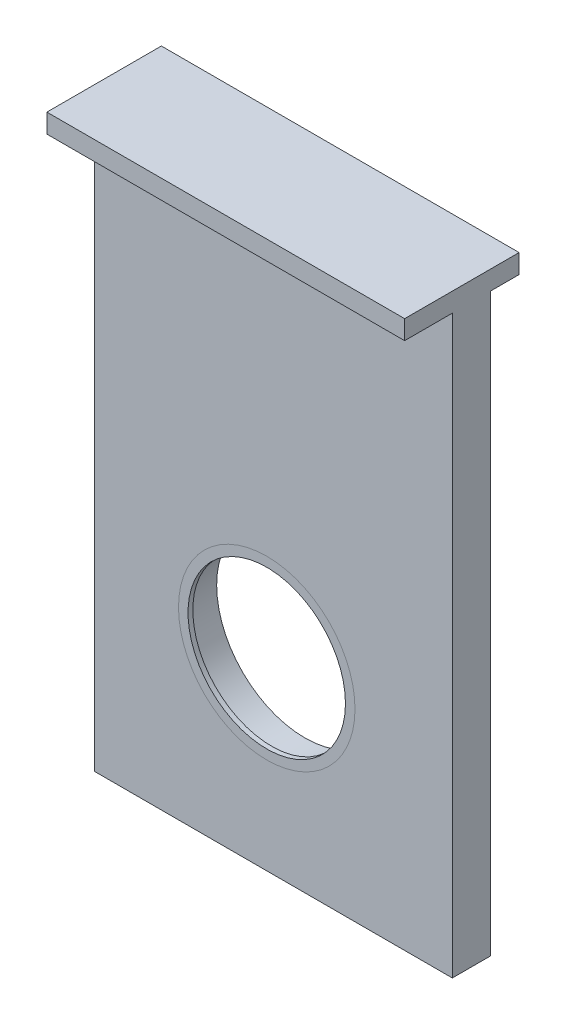
ISO-10303-21;
HEADER;
FILE_DESCRIPTION(('STEP AP214'),'2;1');
FILE_NAME('part.step','',(''),(''),'','','');
FILE_SCHEMA(('AUTOMOTIVE_DESIGN { 1 0 10303 214 1 1 1 1 }'));
ENDSEC;
DATA;
#1=APPLICATION_CONTEXT('core data for automotive mechanical design processes');
#2=APPLICATION_PROTOCOL_DEFINITION('international standard','automotive_design',2000,#1);
#3=PRODUCT_CONTEXT('',#1,'mechanical');
#4=PRODUCT('Part','Part','',(#3));
#5=PRODUCT_RELATED_PRODUCT_CATEGORY('part','',(#4));
#6=PRODUCT_DEFINITION_FORMATION('','',#4);
#7=PRODUCT_DEFINITION_CONTEXT('part definition',#1,'design');
#8=PRODUCT_DEFINITION('design','',#6,#7);
#9=PRODUCT_DEFINITION_SHAPE('','',#8);
#10=(LENGTH_UNIT() NAMED_UNIT(*) SI_UNIT(.MILLI.,.METRE.));
#11=(NAMED_UNIT(*) PLANE_ANGLE_UNIT() SI_UNIT($,.RADIAN.));
#12=(NAMED_UNIT(*) SI_UNIT($,.STERADIAN.) SOLID_ANGLE_UNIT());
#13=UNCERTAINTY_MEASURE_WITH_UNIT(LENGTH_MEASURE(1.E-05),#10,'distance_accuracy_value','');
#14=(GEOMETRIC_REPRESENTATION_CONTEXT(3) GLOBAL_UNCERTAINTY_ASSIGNED_CONTEXT((#13)) GLOBAL_UNIT_ASSIGNED_CONTEXT((#10,
#11,#12)) REPRESENTATION_CONTEXT('',''));
#15=CARTESIAN_POINT('',(0.,0.,0.));
#16=DIRECTION('',(0.,0.,1.));
#17=DIRECTION('',(1.,0.,0.));
#18=AXIS2_PLACEMENT_3D('',#15,#16,#17);
#19=CARTESIAN_POINT('',(98.2196206034018,38.6276036338558,7.));
#20=DIRECTION('',(0.,0.,1.));
#21=DIRECTION('',(1.,0.,0.));
#22=AXIS2_PLACEMENT_3D('',#19,#20,#21);
#23=CYLINDRICAL_SURFACE('',#22,18.5);
#24=CARTESIAN_POINT('',(98.2196206034018,38.6276036338558,7.));
#25=DIRECTION('',(0.,0.,1.));
#26=DIRECTION('',(1.,0.,0.));
#27=AXIS2_PLACEMENT_3D('',#24,#25,#26);
#28=CIRCLE('',#27,18.5);
#29=CARTESIAN_POINT('',(116.719620603402,38.6276036338558,7.));
#30=VERTEX_POINT('',#29);
#31=EDGE_CURVE('E11',#30,#30,#28,.T.);
#32=ORIENTED_EDGE('',*,*,#31,.T.);
#33=EDGE_LOOP('',(#32));
#34=FACE_BOUND('',#33,.T.);
#35=CARTESIAN_POINT('',(98.2196206034018,38.6276036338558,8.));
#36=DIRECTION('',(0.,0.,1.));
#37=DIRECTION('',(1.,0.,0.));
#38=AXIS2_PLACEMENT_3D('',#35,#36,#37);
#39=CIRCLE('',#38,18.5);
#40=CARTESIAN_POINT('',(116.719620603402,38.6276036338558,8.));
#41=VERTEX_POINT('',#40);
#42=EDGE_CURVE('E50',#41,#41,#39,.T.);
#43=ORIENTED_EDGE('',*,*,#42,.F.);
#44=EDGE_LOOP('',(#43));
#45=FACE_BOUND('',#44,.T.);
#46=ADVANCED_FACE('F47',(#34,#45),#23,.T.);
#47=CARTESIAN_POINT('',(98.2196206034018,38.6276036338558,7.));
#48=DIRECTION('',(0.,0.,1.));
#49=DIRECTION('',(1.,0.,0.));
#50=AXIS2_PLACEMENT_3D('',#47,#48,#49);
#51=PLANE('',#50);
#52=CARTESIAN_POINT('',(98.2196206034018,38.6276036338558,7.));
#53=DIRECTION('',(0.,0.,1.));
#54=DIRECTION('',(1.,0.,0.));
#55=AXIS2_PLACEMENT_3D('',#52,#53,#54);
#56=CIRCLE('',#55,16.5);
#57=CARTESIAN_POINT('',(114.719620603402,38.6276036338558,7.));
#58=VERTEX_POINT('',#57);
#59=EDGE_CURVE('E57',#58,#58,#56,.T.);
#60=ORIENTED_EDGE('',*,*,#59,.T.);
#61=EDGE_LOOP('',(#60));
#62=FACE_BOUND('',#61,.T.);
#63=ORIENTED_EDGE('',*,*,#31,.F.);
#64=EDGE_LOOP('',(#63));
#65=FACE_BOUND('',#64,.T.);
#66=ADVANCED_FACE('F65',(#62,#65),#51,.F.);
#67=CARTESIAN_POINT('',(98.2196206034018,38.6276036338558,8.));
#68=DIRECTION('',(0.,0.,1.));
#69=DIRECTION('',(1.,0.,0.));
#70=AXIS2_PLACEMENT_3D('',#67,#68,#69);
#71=PLANE('',#70);
#72=CARTESIAN_POINT('',(98.2196206034018,38.6276036338558,8.));
#73=DIRECTION('',(0.,0.,1.));
#74=DIRECTION('',(1.,0.,0.));
#75=AXIS2_PLACEMENT_3D('',#72,#73,#74);
#76=CIRCLE('',#75,16.5);
#77=CARTESIAN_POINT('',(114.719620603402,38.6276036338558,8.));
#78=VERTEX_POINT('',#77);
#79=EDGE_CURVE('E59',#78,#78,#76,.T.);
#80=ORIENTED_EDGE('',*,*,#79,.F.);
#81=EDGE_LOOP('',(#80));
#82=FACE_BOUND('',#81,.T.);
#83=ORIENTED_EDGE('',*,*,#42,.T.);
#84=EDGE_LOOP('',(#83));
#85=FACE_BOUND('',#84,.T.);
#86=ADVANCED_FACE('F71',(#82,#85),#71,.T.);
#87=CARTESIAN_POINT('',(98.2196206034018,38.6276036338558,7.));
#88=DIRECTION('',(0.,0.,1.));
#89=DIRECTION('',(1.,0.,0.));
#90=AXIS2_PLACEMENT_3D('',#87,#88,#89);
#91=CYLINDRICAL_SURFACE('',#90,16.5);
#92=ORIENTED_EDGE('',*,*,#59,.F.);
#93=EDGE_LOOP('',(#92));
#94=FACE_BOUND('',#93,.T.);
#95=ORIENTED_EDGE('',*,*,#79,.T.);
#96=EDGE_LOOP('',(#95));
#97=FACE_BOUND('',#96,.T.);
#98=ADVANCED_FACE('F68',(#94,#97),#91,.F.);
#99=CLOSED_SHELL('',(#46,#66,#86,#98));
#100=MANIFOLD_SOLID_BREP('B2',#99);
#101=CARTESIAN_POINT('',(62.1258493643405,0.,8.));
#102=DIRECTION('',(-1.,0.,0.));
#103=DIRECTION('',(0.,-1.,0.));
#104=AXIS2_PLACEMENT_3D('',#101,#102,#103);
#105=PLANE('',#104);
#106=DIRECTION('',(0.,1.,0.));
#107=VECTOR('',#106,1.);
#108=CARTESIAN_POINT('',(62.1258493643405,0.,8.));
#109=LINE('',#108,#107);
#110=CARTESIAN_POINT('',(62.1258493643405,0.,8.));
#111=VERTEX_POINT('',#110);
#112=CARTESIAN_POINT('',(62.1258493643405,120.71,8.));
#113=VERTEX_POINT('',#112);
#114=EDGE_CURVE('E237',#111,#113,#109,.T.);
#115=ORIENTED_EDGE('',*,*,#114,.T.);
#116=DIRECTION('',(0.,0.,1.));
#117=VECTOR('',#116,1.);
#118=CARTESIAN_POINT('',(62.1258493643405,120.71,-6.));
#119=LINE('',#118,#117);
#120=CARTESIAN_POINT('',(62.1258493643405,120.71,18.));
#121=VERTEX_POINT('',#120);
#122=EDGE_CURVE('E189',#113,#121,#119,.T.);
#123=ORIENTED_EDGE('',*,*,#122,.T.);
#124=DIRECTION('',(0.,-1.,0.));
#125=VECTOR('',#124,1.);
#126=CARTESIAN_POINT('',(62.1258493643405,124.71,18.));
#127=LINE('',#126,#125);
#128=CARTESIAN_POINT('',(62.1258493643405,124.71,18.));
#129=VERTEX_POINT('',#128);
#130=EDGE_CURVE('E187',#129,#121,#127,.T.);
#131=ORIENTED_EDGE('',*,*,#130,.F.);
#132=DIRECTION('',(0.,0.,-1.));
#133=VECTOR('',#132,1.);
#134=CARTESIAN_POINT('',(62.1258493643405,124.71,8.));
#135=LINE('',#134,#133);
#136=CARTESIAN_POINT('',(62.1258493643405,124.71,-6.));
#137=VERTEX_POINT('',#136);
#138=EDGE_CURVE('E172',#129,#137,#135,.T.);
#139=ORIENTED_EDGE('',*,*,#138,.T.);
#140=DIRECTION('',(0.,-1.,0.));
#141=VECTOR('',#140,1.);
#142=CARTESIAN_POINT('',(62.1258493643405,124.71,-6.));
#143=LINE('',#142,#141);
#144=CARTESIAN_POINT('',(62.1258493643405,120.71,-6.));
#145=VERTEX_POINT('',#144);
#146=EDGE_CURVE('E213',#137,#145,#143,.T.);
#147=ORIENTED_EDGE('',*,*,#146,.T.);
#148=CARTESIAN_POINT('',(62.1258493643405,120.71,0.));
#149=VERTEX_POINT('',#148);
#150=EDGE_CURVE('E230',#145,#149,#119,.T.);
#151=ORIENTED_EDGE('',*,*,#150,.T.);
#152=DIRECTION('',(0.,1.,0.));
#153=VECTOR('',#152,1.);
#154=CARTESIAN_POINT('',(62.1258493643405,0.,0.));
#155=LINE('',#154,#153);
#156=CARTESIAN_POINT('',(62.1258493643405,0.,0.));
#157=VERTEX_POINT('',#156);
#158=EDGE_CURVE('E128',#157,#149,#155,.T.);
#159=ORIENTED_EDGE('',*,*,#158,.F.);
#160=DIRECTION('',(0.,0.,-1.));
#161=VECTOR('',#160,1.);
#162=CARTESIAN_POINT('',(62.1258493643405,0.,8.));
#163=LINE('',#162,#161);
#164=EDGE_CURVE('E118',#111,#157,#163,.T.);
#165=ORIENTED_EDGE('',*,*,#164,.F.);
#166=EDGE_LOOP('',(#115,#123,#131,#139,#147,#151,#159,#165));
#167=FACE_BOUND('',#166,.T.);
#168=ADVANCED_FACE('F109',(#167),#105,.T.);
#169=CARTESIAN_POINT('',(62.1258493643405,0.,8.));
#170=DIRECTION('',(0.,1.,0.));
#171=DIRECTION('',(-1.,0.,0.));
#172=AXIS2_PLACEMENT_3D('',#169,#170,#171);
#173=PLANE('',#172);
#174=DIRECTION('',(1.,0.,0.));
#175=VECTOR('',#174,1.);
#176=CARTESIAN_POINT('',(62.1258493643405,0.,0.));
#177=LINE('',#176,#175);
#178=CARTESIAN_POINT('',(137.12584936434,0.,0.));
#179=VERTEX_POINT('',#178);
#180=EDGE_CURVE('E241',#157,#179,#177,.T.);
#181=ORIENTED_EDGE('',*,*,#180,.T.);
#182=DIRECTION('',(0.,0.,-1.));
#183=VECTOR('',#182,1.);
#184=CARTESIAN_POINT('',(137.12584936434,0.,8.));
#185=LINE('',#184,#183);
#186=CARTESIAN_POINT('',(137.12584936434,0.,8.));
#187=VERTEX_POINT('',#186);
#188=EDGE_CURVE('E257',#187,#179,#185,.T.);
#189=ORIENTED_EDGE('',*,*,#188,.F.);
#190=DIRECTION('',(1.,0.,0.));
#191=VECTOR('',#190,1.);
#192=CARTESIAN_POINT('',(62.1258493643405,0.,8.));
#193=LINE('',#192,#191);
#194=EDGE_CURVE('E184',#111,#187,#193,.T.);
#195=ORIENTED_EDGE('',*,*,#194,.F.);
#196=ORIENTED_EDGE('',*,*,#164,.T.);
#197=EDGE_LOOP('',(#181,#189,#195,#196));
#198=FACE_BOUND('',#197,.T.);
#199=ADVANCED_FACE('F274',(#198),#173,.F.);
#200=CARTESIAN_POINT('',(137.125849364341,124.71,8.));
#201=DIRECTION('',(1.,0.,0.));
#202=DIRECTION('',(0.,1.,0.));
#203=AXIS2_PLACEMENT_3D('',#200,#201,#202);
#204=PLANE('',#203);
#205=DIRECTION('',(0.,-1.,0.));
#206=VECTOR('',#205,1.);
#207=CARTESIAN_POINT('',(137.125849364341,124.71,0.));
#208=LINE('',#207,#206);
#209=CARTESIAN_POINT('',(137.125849364341,120.71,0.));
#210=VERTEX_POINT('',#209);
#211=EDGE_CURVE('E249',#210,#179,#208,.T.);
#212=ORIENTED_EDGE('',*,*,#211,.F.);
#213=DIRECTION('',(0.,0.,1.));
#214=VECTOR('',#213,1.);
#215=CARTESIAN_POINT('',(137.125849364341,120.71,-6.));
#216=LINE('',#215,#214);
#217=CARTESIAN_POINT('',(137.125849364341,120.71,-6.));
#218=VERTEX_POINT('',#217);
#219=EDGE_CURVE('E224',#218,#210,#216,.T.);
#220=ORIENTED_EDGE('',*,*,#219,.F.);
#221=DIRECTION('',(0.,1.,0.));
#222=VECTOR('',#221,1.);
#223=CARTESIAN_POINT('',(137.125849364341,120.71,-6.));
#224=LINE('',#223,#222);
#225=CARTESIAN_POINT('',(137.125849364341,124.71,-6.));
#226=VERTEX_POINT('',#225);
#227=EDGE_CURVE('E220',#218,#226,#224,.T.);
#228=ORIENTED_EDGE('',*,*,#227,.T.);
#229=DIRECTION('',(0.,0.,-1.));
#230=VECTOR('',#229,1.);
#231=CARTESIAN_POINT('',(137.125849364341,124.71,8.));
#232=LINE('',#231,#230);
#233=CARTESIAN_POINT('',(137.125849364341,124.71,18.));
#234=VERTEX_POINT('',#233);
#235=EDGE_CURVE('E183',#234,#226,#232,.T.);
#236=ORIENTED_EDGE('',*,*,#235,.F.);
#237=DIRECTION('',(0.,1.,0.));
#238=VECTOR('',#237,1.);
#239=CARTESIAN_POINT('',(137.125849364341,120.71,18.));
#240=LINE('',#239,#238);
#241=CARTESIAN_POINT('',(137.125849364341,120.71,18.));
#242=VERTEX_POINT('',#241);
#243=EDGE_CURVE('E199',#242,#234,#240,.T.);
#244=ORIENTED_EDGE('',*,*,#243,.F.);
#245=CARTESIAN_POINT('',(137.125849364341,120.71,8.));
#246=VERTEX_POINT('',#245);
#247=EDGE_CURVE('E229',#246,#242,#216,.T.);
#248=ORIENTED_EDGE('',*,*,#247,.F.);
#249=DIRECTION('',(0.,-1.,0.));
#250=VECTOR('',#249,1.);
#251=CARTESIAN_POINT('',(137.125849364341,124.71,8.));
#252=LINE('',#251,#250);
#253=EDGE_CURVE('E240',#246,#187,#252,.T.);
#254=ORIENTED_EDGE('',*,*,#253,.T.);
#255=ORIENTED_EDGE('',*,*,#188,.T.);
#256=EDGE_LOOP('',(#212,#220,#228,#236,#244,#248,#254,#255));
#257=FACE_BOUND('',#256,.T.);
#258=ADVANCED_FACE('F267',(#257),#204,.T.);
#259=CARTESIAN_POINT('',(62.1258493643405,124.71,8.));
#260=DIRECTION('',(0.,1.,0.));
#261=DIRECTION('',(0.,0.,1.));
#262=AXIS2_PLACEMENT_3D('',#259,#260,#261);
#263=PLANE('',#262);
#264=ORIENTED_EDGE('',*,*,#235,.T.);
#265=DIRECTION('',(-1.,0.,0.));
#266=VECTOR('',#265,1.);
#267=CARTESIAN_POINT('',(137.125849364341,124.71,-6.));
#268=LINE('',#267,#266);
#269=EDGE_CURVE('E178',#226,#137,#268,.T.);
#270=ORIENTED_EDGE('',*,*,#269,.T.);
#271=ORIENTED_EDGE('',*,*,#138,.F.);
#272=DIRECTION('',(-1.,0.,0.));
#273=VECTOR('',#272,1.);
#274=CARTESIAN_POINT('',(137.125849364341,124.71,18.));
#275=LINE('',#274,#273);
#276=EDGE_CURVE('E176',#234,#129,#275,.T.);
#277=ORIENTED_EDGE('',*,*,#276,.F.);
#278=EDGE_LOOP('',(#264,#270,#271,#277));
#279=FACE_BOUND('',#278,.T.);
#280=ADVANCED_FACE('F174',(#279),#263,.T.);
#281=CARTESIAN_POINT('',(0.,0.,8.));
#282=DIRECTION('',(0.,0.,-1.));
#283=DIRECTION('',(-1.,0.,0.));
#284=AXIS2_PLACEMENT_3D('',#281,#282,#283);
#285=PLANE('',#284);
#286=CARTESIAN_POINT('',(98.2196206034018,38.6276036338558,8.));
#287=DIRECTION('',(0.,0.,1.));
#288=DIRECTION('',(1.,0.,0.));
#289=AXIS2_PLACEMENT_3D('',#286,#287,#288);
#290=CIRCLE('',#289,18.5);
#291=CARTESIAN_POINT('',(116.719620603402,38.6276036338558,8.));
#292=VERTEX_POINT('',#291);
#293=EDGE_CURVE('E204',#292,#292,#290,.T.);
#294=ORIENTED_EDGE('',*,*,#293,.F.);
#295=EDGE_LOOP('',(#294));
#296=FACE_BOUND('',#295,.T.);
#297=ORIENTED_EDGE('',*,*,#253,.F.);
#298=DIRECTION('',(-1.,0.,0.));
#299=VECTOR('',#298,1.);
#300=CARTESIAN_POINT('',(0.,120.71,8.));
#301=LINE('',#300,#299);
#302=EDGE_CURVE('E228',#246,#113,#301,.T.);
#303=ORIENTED_EDGE('',*,*,#302,.T.);
#304=ORIENTED_EDGE('',*,*,#114,.F.);
#305=ORIENTED_EDGE('',*,*,#194,.T.);
#306=EDGE_LOOP('',(#297,#303,#304,#305));
#307=FACE_BOUND('',#306,.T.);
#308=ADVANCED_FACE('F277',(#296,#307),#285,.F.);
#309=CARTESIAN_POINT('',(0.,0.,0.));
#310=DIRECTION('',(0.,0.,-1.));
#311=DIRECTION('',(-1.,0.,0.));
#312=AXIS2_PLACEMENT_3D('',#309,#310,#311);
#313=PLANE('',#312);
#314=CARTESIAN_POINT('',(98.2196206034018,38.6276036338558,0.));
#315=DIRECTION('',(0.,0.,-1.));
#316=DIRECTION('',(-1.,0.,0.));
#317=AXIS2_PLACEMENT_3D('',#314,#315,#316);
#318=CIRCLE('',#317,18.5);
#319=CARTESIAN_POINT('',(79.7196206034018,38.6276036338558,0.));
#320=VERTEX_POINT('',#319);
#321=EDGE_CURVE('E112',#320,#320,#318,.T.);
#322=ORIENTED_EDGE('',*,*,#321,.F.);
#323=EDGE_LOOP('',(#322));
#324=FACE_BOUND('',#323,.T.);
#325=DIRECTION('',(-1.,0.,0.));
#326=VECTOR('',#325,1.);
#327=CARTESIAN_POINT('',(0.,120.71,0.));
#328=LINE('',#327,#326);
#329=EDGE_CURVE('E45',#210,#149,#328,.T.);
#330=ORIENTED_EDGE('',*,*,#329,.F.);
#331=ORIENTED_EDGE('',*,*,#211,.T.);
#332=ORIENTED_EDGE('',*,*,#180,.F.);
#333=ORIENTED_EDGE('',*,*,#158,.T.);
#334=EDGE_LOOP('',(#330,#331,#332,#333));
#335=FACE_BOUND('',#334,.T.);
#336=ADVANCED_FACE('F283',(#324,#335),#313,.T.);
#337=CARTESIAN_POINT('',(0.,0.,-6.));
#338=DIRECTION('',(0.,0.,1.));
#339=DIRECTION('',(1.,0.,0.));
#340=AXIS2_PLACEMENT_3D('',#337,#338,#339);
#341=PLANE('',#340);
#342=ORIENTED_EDGE('',*,*,#269,.F.);
#343=ORIENTED_EDGE('',*,*,#227,.F.);
#344=DIRECTION('',(1.,0.,0.));
#345=VECTOR('',#344,1.);
#346=CARTESIAN_POINT('',(62.1258493643405,120.71,-6.));
#347=LINE('',#346,#345);
#348=EDGE_CURVE('E216',#145,#218,#347,.T.);
#349=ORIENTED_EDGE('',*,*,#348,.F.);
#350=ORIENTED_EDGE('',*,*,#146,.F.);
#351=EDGE_LOOP('',(#342,#343,#349,#350));
#352=FACE_BOUND('',#351,.T.);
#353=ADVANCED_FACE('F265',(#352),#341,.F.);
#354=CARTESIAN_POINT('',(62.1258493643405,120.71,-6.));
#355=DIRECTION('',(0.,-1.,0.));
#356=DIRECTION('',(0.,0.,-1.));
#357=AXIS2_PLACEMENT_3D('',#354,#355,#356);
#358=PLANE('',#357);
#359=ORIENTED_EDGE('',*,*,#219,.T.);
#360=ORIENTED_EDGE('',*,*,#329,.T.);
#361=ORIENTED_EDGE('',*,*,#150,.F.);
#362=ORIENTED_EDGE('',*,*,#348,.T.);
#363=EDGE_LOOP('',(#359,#360,#361,#362));
#364=FACE_BOUND('',#363,.T.);
#365=ADVANCED_FACE('F269',(#364),#358,.T.);
#366=ORIENTED_EDGE('',*,*,#302,.F.);
#367=ORIENTED_EDGE('',*,*,#247,.T.);
#368=DIRECTION('',(1.,0.,0.));
#369=VECTOR('',#368,1.);
#370=CARTESIAN_POINT('',(62.1258493643405,120.71,18.));
#371=LINE('',#370,#369);
#372=EDGE_CURVE('E194',#121,#242,#371,.T.);
#373=ORIENTED_EDGE('',*,*,#372,.F.);
#374=ORIENTED_EDGE('',*,*,#122,.F.);
#375=EDGE_LOOP('',(#366,#367,#373,#374));
#376=FACE_BOUND('',#375,.T.);
#377=ADVANCED_FACE('F280',(#376),#358,.T.);
#378=CARTESIAN_POINT('',(0.,0.,18.));
#379=DIRECTION('',(0.,0.,1.));
#380=DIRECTION('',(1.,0.,0.));
#381=AXIS2_PLACEMENT_3D('',#378,#379,#380);
#382=PLANE('',#381);
#383=ORIENTED_EDGE('',*,*,#276,.T.);
#384=ORIENTED_EDGE('',*,*,#130,.T.);
#385=ORIENTED_EDGE('',*,*,#372,.T.);
#386=ORIENTED_EDGE('',*,*,#243,.T.);
#387=EDGE_LOOP('',(#383,#384,#385,#386));
#388=FACE_BOUND('',#387,.T.);
#389=ADVANCED_FACE('F197',(#388),#382,.T.);
#390=CARTESIAN_POINT('',(98.2196206034018,38.6276036338558,-6.));
#391=DIRECTION('',(0.,0.,1.));
#392=DIRECTION('',(1.,0.,0.));
#393=AXIS2_PLACEMENT_3D('',#390,#391,#392);
#394=CYLINDRICAL_SURFACE('',#393,18.5);
#395=ORIENTED_EDGE('',*,*,#321,.T.);
#396=EDGE_LOOP('',(#395));
#397=FACE_BOUND('',#396,.T.);
#398=ORIENTED_EDGE('',*,*,#293,.T.);
#399=EDGE_LOOP('',(#398));
#400=FACE_BOUND('',#399,.T.);
#401=ADVANCED_FACE('F330',(#397,#400),#394,.F.);
#402=CLOSED_SHELL('',(#168,#199,#258,#280,#308,#336,#353,#365,#377,#389,#401));
#403=MANIFOLD_SOLID_BREP('B6',#402);
#404=ADVANCED_BREP_SHAPE_REPRESENTATION('',(#18,#100,#403),#14);
#405=SHAPE_DEFINITION_REPRESENTATION(#9,#404);
ENDSEC;
END-ISO-10303-21;
